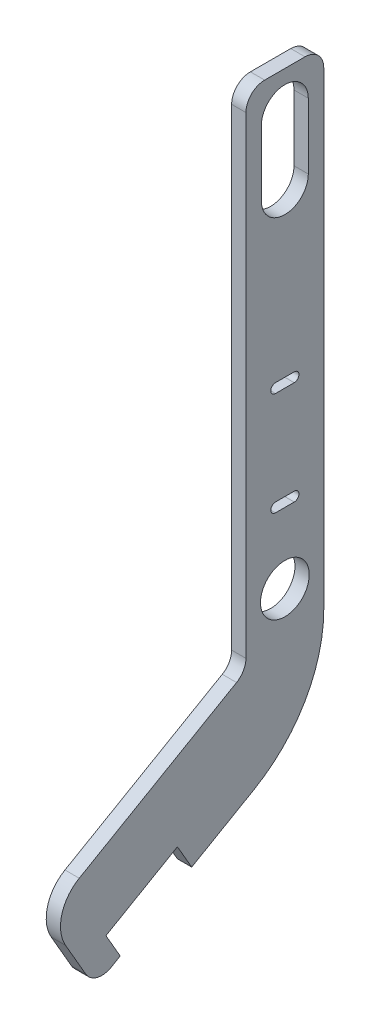
ISO-10303-21;
HEADER;
FILE_DESCRIPTION(('STEP AP214'),'2;1');
FILE_NAME('part.step','',(''),(''),'','','');
FILE_SCHEMA(('AUTOMOTIVE_DESIGN { 1 0 10303 214 1 1 1 1 }'));
ENDSEC;
DATA;
#1=APPLICATION_CONTEXT('core data for automotive mechanical design processes');
#2=APPLICATION_PROTOCOL_DEFINITION('international standard','automotive_design',2000,#1);
#3=PRODUCT_CONTEXT('',#1,'mechanical');
#4=PRODUCT('Part','Part','',(#3));
#5=PRODUCT_RELATED_PRODUCT_CATEGORY('part','',(#4));
#6=PRODUCT_DEFINITION_FORMATION('','',#4);
#7=PRODUCT_DEFINITION_CONTEXT('part definition',#1,'design');
#8=PRODUCT_DEFINITION('design','',#6,#7);
#9=PRODUCT_DEFINITION_SHAPE('','',#8);
#10=(LENGTH_UNIT() NAMED_UNIT(*) SI_UNIT(.MILLI.,.METRE.));
#11=(NAMED_UNIT(*) PLANE_ANGLE_UNIT() SI_UNIT($,.RADIAN.));
#12=(NAMED_UNIT(*) SI_UNIT($,.STERADIAN.) SOLID_ANGLE_UNIT());
#13=UNCERTAINTY_MEASURE_WITH_UNIT(LENGTH_MEASURE(1.E-05),#10,'distance_accuracy_value','');
#14=(GEOMETRIC_REPRESENTATION_CONTEXT(3) GLOBAL_UNCERTAINTY_ASSIGNED_CONTEXT((#13)) GLOBAL_UNIT_ASSIGNED_CONTEXT((#10,
#11,#12)) REPRESENTATION_CONTEXT('',''));
#15=CARTESIAN_POINT('',(0.,0.,0.));
#16=DIRECTION('',(0.,0.,1.));
#17=DIRECTION('',(1.,0.,0.));
#18=AXIS2_PLACEMENT_3D('',#15,#16,#17);
#19=CARTESIAN_POINT('',(0.,22.8,-18.4405593862111));
#20=DIRECTION('',(1.,0.,0.));
#21=DIRECTION('',(0.,0.,-1.));
#22=AXIS2_PLACEMENT_3D('',#19,#20,#21);
#23=PLANE('',#22);
#24=CARTESIAN_POINT('',(0.,45.8188404030531,-28.2201127180248));
#25=DIRECTION('',(1.,0.,0.));
#26=DIRECTION('',(0.,0.,-1.));
#27=AXIS2_PLACEMENT_3D('',#24,#25,#26);
#28=CIRCLE('',#27,0.499999999999987);
#29=CARTESIAN_POINT('',(0.,46.3188404030531,-28.2201127180248));
#30=VERTEX_POINT('',#29);
#31=CARTESIAN_POINT('',(0.,45.3188404030531,-28.2201127180248));
#32=VERTEX_POINT('',#31);
#33=EDGE_CURVE('E62',#30,#32,#28,.T.);
#34=ORIENTED_EDGE('',*,*,#33,.F.);
#35=DIRECTION('',(0.,0.,1.));
#36=VECTOR('',#35,1.);
#37=CARTESIAN_POINT('',(0.,46.3188404030531,-28.2201127180248));
#38=LINE('',#37,#36);
#39=CARTESIAN_POINT('',(0.,46.3188404030531,-30.2201127180248));
#40=VERTEX_POINT('',#39);
#41=EDGE_CURVE('E255',#40,#30,#38,.T.);
#42=ORIENTED_EDGE('',*,*,#41,.F.);
#43=CARTESIAN_POINT('',(0.,45.8188404030531,-30.2201127180248));
#44=DIRECTION('',(1.,0.,0.));
#45=DIRECTION('',(0.,0.,-1.));
#46=AXIS2_PLACEMENT_3D('',#43,#44,#45);
#47=CIRCLE('',#46,0.499999999999987);
#48=CARTESIAN_POINT('',(0.,45.3188404030532,-30.2201127180248));
#49=VERTEX_POINT('',#48);
#50=EDGE_CURVE('E239',#49,#40,#47,.T.);
#51=ORIENTED_EDGE('',*,*,#50,.F.);
#52=DIRECTION('',(0.,0.,-1.));
#53=VECTOR('',#52,1.);
#54=CARTESIAN_POINT('',(0.,45.3188404030531,-28.2201127180248));
#55=LINE('',#54,#53);
#56=EDGE_CURVE('E249',#32,#49,#55,.T.);
#57=ORIENTED_EDGE('',*,*,#56,.F.);
#58=EDGE_LOOP('',(#34,#42,#51,#57));
#59=FACE_BOUND('',#58,.T.);
#60=CARTESIAN_POINT('',(0.,34.8,-28.2201127180248));
#61=DIRECTION('',(1.,0.,0.));
#62=DIRECTION('',(0.,0.,-1.));
#63=AXIS2_PLACEMENT_3D('',#60,#61,#62);
#64=CIRCLE('',#63,0.499999999999987);
#65=CARTESIAN_POINT('',(0.,35.3,-28.2201127180248));
#66=VERTEX_POINT('',#65);
#67=CARTESIAN_POINT('',(0.,34.3,-28.2201127180248));
#68=VERTEX_POINT('',#67);
#69=EDGE_CURVE('E70',#66,#68,#64,.T.);
#70=ORIENTED_EDGE('',*,*,#69,.F.);
#71=DIRECTION('',(0.,0.,1.));
#72=VECTOR('',#71,1.);
#73=CARTESIAN_POINT('',(0.,35.3,-28.2201127180248));
#74=LINE('',#73,#72);
#75=CARTESIAN_POINT('',(0.,35.3,-30.2201127180248));
#76=VERTEX_POINT('',#75);
#77=EDGE_CURVE('E272',#76,#66,#74,.T.);
#78=ORIENTED_EDGE('',*,*,#77,.F.);
#79=CARTESIAN_POINT('',(0.,34.8,-30.2201127180248));
#80=DIRECTION('',(1.,0.,0.));
#81=DIRECTION('',(0.,0.,-1.));
#82=AXIS2_PLACEMENT_3D('',#79,#80,#81);
#83=CIRCLE('',#82,0.499999999999987);
#84=CARTESIAN_POINT('',(0.,34.3,-30.2201127180248));
#85=VERTEX_POINT('',#84);
#86=EDGE_CURVE('E269',#85,#76,#83,.T.);
#87=ORIENTED_EDGE('',*,*,#86,.F.);
#88=DIRECTION('',(0.,0.,-1.));
#89=VECTOR('',#88,1.);
#90=CARTESIAN_POINT('',(0.,34.3,-28.2201127180248));
#91=LINE('',#90,#89);
#92=EDGE_CURVE('E266',#68,#85,#91,.T.);
#93=ORIENTED_EDGE('',*,*,#92,.F.);
#94=EDGE_LOOP('',(#70,#78,#87,#93));
#95=FACE_BOUND('',#94,.T.);
#96=DIRECTION('',(0.,1.,0.));
#97=VECTOR('',#96,1.);
#98=CARTESIAN_POINT('',(0.,22.8,-33.3701127180248));
#99=LINE('',#98,#97);
#100=CARTESIAN_POINT('',(0.,22.8,-33.3701127180248));
#101=VERTEX_POINT('',#100);
#102=CARTESIAN_POINT('',(0.,72.8376808061063,-33.3701127180248));
#103=VERTEX_POINT('',#102);
#104=EDGE_CURVE('E376',#101,#103,#99,.T.);
#105=ORIENTED_EDGE('',*,*,#104,.T.);
#106=CARTESIAN_POINT('',(0.,72.8376808061063,-31.3701127180248));
#107=DIRECTION('',(1.,0.,0.));
#108=DIRECTION('',(0.,0.,-1.));
#109=AXIS2_PLACEMENT_3D('',#106,#107,#108);
#110=CIRCLE('',#109,2.);
#111=CARTESIAN_POINT('',(0.,74.8376808061063,-31.3701127180248));
#112=VERTEX_POINT('',#111);
#113=EDGE_CURVE('E383',#103,#112,#110,.T.);
#114=ORIENTED_EDGE('',*,*,#113,.T.);
#115=DIRECTION('',(0.,0.,1.));
#116=VECTOR('',#115,1.);
#117=CARTESIAN_POINT('',(0.,74.8376808061063,-33.3701127180248));
#118=LINE('',#117,#116);
#119=CARTESIAN_POINT('',(0.,74.8376808061063,-27.0701127180248));
#120=VERTEX_POINT('',#119);
#121=EDGE_CURVE('E380',#112,#120,#118,.T.);
#122=ORIENTED_EDGE('',*,*,#121,.T.);
#123=CARTESIAN_POINT('',(0.,72.8376808061063,-27.0701127180248));
#124=DIRECTION('',(1.,0.,0.));
#125=DIRECTION('',(0.,0.,-1.));
#126=AXIS2_PLACEMENT_3D('',#123,#124,#125);
#127=CIRCLE('',#126,2.);
#128=CARTESIAN_POINT('',(0.,72.8376808061063,-25.0701127180248));
#129=VERTEX_POINT('',#128);
#130=EDGE_CURVE('E377',#120,#129,#127,.T.);
#131=ORIENTED_EDGE('',*,*,#130,.T.);
#132=DIRECTION('',(0.,-1.,0.));
#133=VECTOR('',#132,1.);
#134=CARTESIAN_POINT('',(0.,64.8,-25.0701127180248));
#135=LINE('',#134,#133);
#136=CARTESIAN_POINT('',(0.,22.4365272144081,-25.0701127180249));
#137=VERTEX_POINT('',#136);
#138=EDGE_CURVE('E435',#129,#137,#135,.T.);
#139=ORIENTED_EDGE('',*,*,#138,.T.);
#140=CARTESIAN_POINT('',(0.,22.4365272144081,-23.0701127180249));
#141=DIRECTION('',(1.,0.,0.));
#142=DIRECTION('',(0.,0.,-1.));
#143=AXIS2_PLACEMENT_3D('',#140,#141,#142);
#144=CIRCLE('',#143,2.);
#145=CARTESIAN_POINT('',(0.,20.7044764068392,-24.0701127180248));
#146=VERTEX_POINT('',#145);
#147=EDGE_CURVE('E302',#137,#146,#144,.F.);
#148=ORIENTED_EDGE('',*,*,#147,.T.);
#149=DIRECTION('',(0.,-0.499999999999995,0.866025403784442));
#150=VECTOR('',#149,1.);
#151=CARTESIAN_POINT('',(0.,9.02006165897975,-3.8321127180249));
#152=LINE('',#151,#150);
#153=CARTESIAN_POINT('',(0.,11.0200616589797,-7.29621433316266));
#154=VERTEX_POINT('',#153);
#155=EDGE_CURVE('E299',#146,#154,#152,.T.);
#156=ORIENTED_EDGE('',*,*,#155,.T.);
#157=CARTESIAN_POINT('',(0.,7.55596004384196,-9.29621433316264));
#158=DIRECTION('',(1.,0.,0.));
#159=DIRECTION('',(0.,0.,-1.));
#160=AXIS2_PLACEMENT_3D('',#157,#158,#159);
#161=CIRCLE('',#160,4.);
#162=CARTESIAN_POINT('',(0.,5.55596004384197,-5.83211271802487));
#163=VERTEX_POINT('',#162);
#164=EDGE_CURVE('E297',#154,#163,#161,.T.);
#165=ORIENTED_EDGE('',*,*,#164,.T.);
#166=DIRECTION('',(0.,-0.866025403784441,-0.499999999999996));
#167=VECTOR('',#166,1.);
#168=CARTESIAN_POINT('',(0.,1.41982271536749,-8.22011271802485));
#169=LINE('',#168,#167);
#170=CARTESIAN_POINT('',(0.,1.83205080756888,-7.98211271802485));
#171=VERTEX_POINT('',#170);
#172=EDGE_CURVE('E295',#163,#171,#169,.T.);
#173=ORIENTED_EDGE('',*,*,#172,.T.);
#174=CARTESIAN_POINT('',(0.,2.83205080756887,-9.71416352559373));
#175=DIRECTION('',(1.,0.,0.));
#176=DIRECTION('',(0.,0.,-1.));
#177=AXIS2_PLACEMENT_3D('',#174,#175,#176);
#178=CIRCLE('',#177,2.);
#179=CARTESIAN_POINT('',(0.,1.09999999999999,-10.7141635255937));
#180=VERTEX_POINT('',#179);
#181=EDGE_CURVE('E293',#171,#180,#178,.T.);
#182=ORIENTED_EDGE('',*,*,#181,.T.);
#183=DIRECTION('',(0.,0.499999999999995,-0.866025403784441));
#184=VECTOR('',#183,1.);
#185=CARTESIAN_POINT('',(0.,0.0999999999999994,-8.98211271802484));
#186=LINE('',#185,#184);
#187=CARTESIAN_POINT('',(0.,1.65000000000003,-11.6667914697567));
#188=VERTEX_POINT('',#187);
#189=EDGE_CURVE('E291',#180,#188,#186,.T.);
#190=ORIENTED_EDGE('',*,*,#189,.T.);
#191=DIRECTION('',(0.,-0.866025403784439,-0.5));
#192=VECTOR('',#191,1.);
#193=CARTESIAN_POINT('',(0.,4.289645430735,-10.1427914697567));
#194=LINE('',#193,#192);
#195=CARTESIAN_POINT('',(0.,4.289645430735,-10.1427914697567));
#196=VERTEX_POINT('',#195);
#197=EDGE_CURVE('E348',#196,#188,#194,.T.);
#198=ORIENTED_EDGE('',*,*,#197,.F.);
#199=DIRECTION('',(0.,-0.5,0.866025403784439));
#200=VECTOR('',#199,1.);
#201=CARTESIAN_POINT('',(0.,6.489645430735,-13.9533032464082));
#202=LINE('',#201,#200);
#203=CARTESIAN_POINT('',(0.,8.689645430735,-17.7638150230597));
#204=VERTEX_POINT('',#203);
#205=EDGE_CURVE('E343',#204,#196,#202,.T.);
#206=ORIENTED_EDGE('',*,*,#205,.F.);
#207=DIRECTION('',(0.,0.866025403784438,0.5));
#208=VECTOR('',#207,1.);
#209=CARTESIAN_POINT('',(0.,6.05000000000003,-19.2878150230597));
#210=LINE('',#209,#208);
#211=CARTESIAN_POINT('',(0.,6.04999999999997,-19.2878150230597));
#212=VERTEX_POINT('',#211);
#213=EDGE_CURVE('E338',#212,#204,#210,.T.);
#214=ORIENTED_EDGE('',*,*,#213,.F.);
#215=CARTESIAN_POINT('',(0.,9.87062754749466,-25.9053360521179));
#216=VERTEX_POINT('',#215);
#217=EDGE_CURVE('E290',#212,#216,#186,.T.);
#218=ORIENTED_EDGE('',*,*,#217,.T.);
#219=CARTESIAN_POINT('',(0.,22.8,-18.4405593862111));
#220=DIRECTION('',(1.,0.,0.));
#221=DIRECTION('',(0.,0.,-1.));
#222=AXIS2_PLACEMENT_3D('',#219,#220,#221);
#223=CIRCLE('',#222,14.9295533318137);
#224=EDGE_CURVE('E287',#216,#101,#223,.T.);
#225=ORIENTED_EDGE('',*,*,#224,.T.);
#226=EDGE_LOOP('',(#105,#114,#122,#131,#139,#148,#156,#165,#173,#182,#190,#198,#206,#214,#218,#225));
#227=FACE_BOUND('',#226,.T.);
#228=CARTESIAN_POINT('',(0.,70.8376808061063,-29.2201127180248));
#229=DIRECTION('',(1.,0.,0.));
#230=DIRECTION('',(0.,0.,-1.));
#231=AXIS2_PLACEMENT_3D('',#228,#229,#230);
#232=CIRCLE('',#231,2.5);
#233=CARTESIAN_POINT('',(0.,70.8376808061063,-31.7201127180248));
#234=VERTEX_POINT('',#233);
#235=CARTESIAN_POINT('',(0.,70.8376808061063,-26.7201127180248));
#236=VERTEX_POINT('',#235);
#237=EDGE_CURVE('E412',#234,#236,#232,.T.);
#238=ORIENTED_EDGE('',*,*,#237,.F.);
#239=DIRECTION('',(0.,1.,0.));
#240=VECTOR('',#239,1.);
#241=CARTESIAN_POINT('',(0.,70.8376808061063,-31.7201127180248));
#242=LINE('',#241,#240);
#243=CARTESIAN_POINT('',(0.,63.8376808061063,-31.7201127180248));
#244=VERTEX_POINT('',#243);
#245=EDGE_CURVE('E407',#244,#234,#242,.T.);
#246=ORIENTED_EDGE('',*,*,#245,.F.);
#247=CARTESIAN_POINT('',(0.,63.8376808061063,-29.2201127180248));
#248=DIRECTION('',(1.,0.,0.));
#249=DIRECTION('',(0.,0.,-1.));
#250=AXIS2_PLACEMENT_3D('',#247,#248,#249);
#251=CIRCLE('',#250,2.5);
#252=CARTESIAN_POINT('',(0.,63.8376808061063,-26.7201127180248));
#253=VERTEX_POINT('',#252);
#254=EDGE_CURVE('E422',#253,#244,#251,.T.);
#255=ORIENTED_EDGE('',*,*,#254,.F.);
#256=DIRECTION('',(0.,-1.,0.));
#257=VECTOR('',#256,1.);
#258=CARTESIAN_POINT('',(0.,70.8376808061063,-26.7201127180248));
#259=LINE('',#258,#257);
#260=EDGE_CURVE('E417',#236,#253,#259,.T.);
#261=ORIENTED_EDGE('',*,*,#260,.F.);
#262=EDGE_LOOP('',(#238,#246,#255,#261));
#263=FACE_BOUND('',#262,.T.);
#264=CARTESIAN_POINT('',(0.,26.8,-29.2201127180248));
#265=DIRECTION('',(1.,0.,0.));
#266=DIRECTION('',(0.,0.,-1.));
#267=AXIS2_PLACEMENT_3D('',#264,#265,#266);
#268=CIRCLE('',#267,2.60000000000147);
#269=CARTESIAN_POINT('',(0.,26.8,-31.8201127180263));
#270=VERTEX_POINT('',#269);
#271=EDGE_CURVE('E262',#270,#270,#268,.T.);
#272=ORIENTED_EDGE('',*,*,#271,.F.);
#273=EDGE_LOOP('',(#272));
#274=FACE_BOUND('',#273,.T.);
#275=ADVANCED_FACE('F48',(#59,#95,#227,#263,#274),#23,.T.);
#276=CARTESIAN_POINT('',(-1.52399999999999,22.8,-33.3701127180248));
#277=DIRECTION('',(0.,0.,-1.));
#278=DIRECTION('',(0.,1.,0.));
#279=AXIS2_PLACEMENT_3D('',#276,#277,#278);
#280=PLANE('',#279);
#281=DIRECTION('',(0.,1.,0.));
#282=VECTOR('',#281,1.);
#283=CARTESIAN_POINT('',(-1.52399999999999,22.8,-33.3701127180248));
#284=LINE('',#283,#282);
#285=CARTESIAN_POINT('',(-1.524,22.8,-33.3701127180248));
#286=VERTEX_POINT('',#285);
#287=CARTESIAN_POINT('',(-1.524,72.8376808061062,-33.3701127180248));
#288=VERTEX_POINT('',#287);
#289=EDGE_CURVE('E432',#286,#288,#284,.T.);
#290=ORIENTED_EDGE('',*,*,#289,.T.);
#291=DIRECTION('',(1.,0.,0.));
#292=VECTOR('',#291,1.);
#293=CARTESIAN_POINT('',(-1.524,72.8376808061063,-33.3701127180248));
#294=LINE('',#293,#292);
#295=EDGE_CURVE('E373',#288,#103,#294,.T.);
#296=ORIENTED_EDGE('',*,*,#295,.T.);
#297=ORIENTED_EDGE('',*,*,#104,.F.);
#298=DIRECTION('',(1.,0.,0.));
#299=VECTOR('',#298,1.);
#300=CARTESIAN_POINT('',(-1.524,22.8,-33.3701127180248));
#301=LINE('',#300,#299);
#302=EDGE_CURVE('E324',#286,#101,#301,.T.);
#303=ORIENTED_EDGE('',*,*,#302,.F.);
#304=EDGE_LOOP('',(#290,#296,#297,#303));
#305=FACE_BOUND('',#304,.T.);
#306=ADVANCED_FACE('F475',(#305),#280,.T.);
#307=CARTESIAN_POINT('',(-1.52399999999999,64.8,-25.0701127180248));
#308=DIRECTION('',(0.,0.,1.));
#309=DIRECTION('',(0.,-1.,0.));
#310=AXIS2_PLACEMENT_3D('',#307,#308,#309);
#311=PLANE('',#310);
#312=ORIENTED_EDGE('',*,*,#138,.F.);
#313=DIRECTION('',(1.,0.,0.));
#314=VECTOR('',#313,1.);
#315=CARTESIAN_POINT('',(-1.524,72.8376808061063,-25.0701127180248));
#316=LINE('',#315,#314);
#317=CARTESIAN_POINT('',(-1.524,72.8376808061063,-25.0701127180248));
#318=VERTEX_POINT('',#317);
#319=EDGE_CURVE('E385',#129,#318,#316,.F.);
#320=ORIENTED_EDGE('',*,*,#319,.T.);
#321=DIRECTION('',(0.,-1.,0.));
#322=VECTOR('',#321,1.);
#323=CARTESIAN_POINT('',(-1.52399999999999,64.8,-25.0701127180248));
#324=LINE('',#323,#322);
#325=CARTESIAN_POINT('',(-1.524,22.4365272144081,-25.0701127180249));
#326=VERTEX_POINT('',#325);
#327=EDGE_CURVE('E434',#318,#326,#324,.T.);
#328=ORIENTED_EDGE('',*,*,#327,.T.);
#329=DIRECTION('',(1.,0.,0.));
#330=VECTOR('',#329,1.);
#331=CARTESIAN_POINT('',(0.,22.4365272144081,-25.0701127180249));
#332=LINE('',#331,#330);
#333=EDGE_CURVE('E283',#326,#137,#332,.T.);
#334=ORIENTED_EDGE('',*,*,#333,.T.);
#335=EDGE_LOOP('',(#312,#320,#328,#334));
#336=FACE_BOUND('',#335,.T.);
#337=ADVANCED_FACE('F479',(#336),#311,.T.);
#338=CARTESIAN_POINT('',(-1.52399999999999,22.8,-18.4405593862111));
#339=DIRECTION('',(1.,0.,0.));
#340=DIRECTION('',(0.,0.,-1.));
#341=AXIS2_PLACEMENT_3D('',#338,#339,#340);
#342=PLANE('',#341);
#343=DIRECTION('',(0.,0.,1.));
#344=VECTOR('',#343,1.);
#345=CARTESIAN_POINT('',(-1.52399999999999,46.3188404030531,-18.4405593862111));
#346=LINE('',#345,#344);
#347=CARTESIAN_POINT('',(-1.52399999999999,46.3188404030531,-30.2201127180248));
#348=VERTEX_POINT('',#347);
#349=CARTESIAN_POINT('',(-1.52399999999999,46.3188404030531,-28.2201127180248));
#350=VERTEX_POINT('',#349);
#351=EDGE_CURVE('E55',#348,#350,#346,.T.);
#352=ORIENTED_EDGE('',*,*,#351,.T.);
#353=CARTESIAN_POINT('',(-1.52399999999999,45.8188404030531,-28.2201127180248));
#354=DIRECTION('',(1.,0.,0.));
#355=DIRECTION('',(0.,0.,-1.));
#356=AXIS2_PLACEMENT_3D('',#353,#354,#355);
#357=CIRCLE('',#356,0.499999999999987);
#358=CARTESIAN_POINT('',(-1.52399999999999,45.3188404030531,-28.2201127180248));
#359=VERTEX_POINT('',#358);
#360=EDGE_CURVE('E12',#350,#359,#357,.T.);
#361=ORIENTED_EDGE('',*,*,#360,.T.);
#362=DIRECTION('',(0.,0.,-1.));
#363=VECTOR('',#362,1.);
#364=CARTESIAN_POINT('',(-1.52399999999999,45.3188404030531,-18.4405593862111));
#365=LINE('',#364,#363);
#366=CARTESIAN_POINT('',(-1.52399999999999,45.3188404030531,-30.2201127180248));
#367=VERTEX_POINT('',#366);
#368=EDGE_CURVE('E451',#359,#367,#365,.T.);
#369=ORIENTED_EDGE('',*,*,#368,.T.);
#370=CARTESIAN_POINT('',(-1.52399999999999,45.8188404030531,-30.2201127180248));
#371=DIRECTION('',(1.,0.,0.));
#372=DIRECTION('',(0.,0.,-1.));
#373=AXIS2_PLACEMENT_3D('',#370,#371,#372);
#374=CIRCLE('',#373,0.499999999999987);
#375=EDGE_CURVE('E242',#367,#348,#374,.T.);
#376=ORIENTED_EDGE('',*,*,#375,.T.);
#377=EDGE_LOOP('',(#352,#361,#369,#376));
#378=FACE_BOUND('',#377,.T.);
#379=DIRECTION('',(0.,0.,1.));
#380=VECTOR('',#379,1.);
#381=CARTESIAN_POINT('',(-1.52399999999999,35.3,-18.4405593862111));
#382=LINE('',#381,#380);
#383=CARTESIAN_POINT('',(-1.52399999999999,35.3,-30.2201127180248));
#384=VERTEX_POINT('',#383);
#385=CARTESIAN_POINT('',(-1.52399999999999,35.3,-28.2201127180248));
#386=VERTEX_POINT('',#385);
#387=EDGE_CURVE('E445',#384,#386,#382,.T.);
#388=ORIENTED_EDGE('',*,*,#387,.T.);
#389=CARTESIAN_POINT('',(-1.52399999999999,34.8,-28.2201127180248));
#390=DIRECTION('',(1.,0.,0.));
#391=DIRECTION('',(0.,0.,-1.));
#392=AXIS2_PLACEMENT_3D('',#389,#390,#391);
#393=CIRCLE('',#392,0.499999999999987);
#394=CARTESIAN_POINT('',(-1.52399999999999,34.3,-28.2201127180248));
#395=VERTEX_POINT('',#394);
#396=EDGE_CURVE('E448',#386,#395,#393,.T.);
#397=ORIENTED_EDGE('',*,*,#396,.T.);
#398=DIRECTION('',(0.,0.,-1.));
#399=VECTOR('',#398,1.);
#400=CARTESIAN_POINT('',(-1.52399999999999,34.3,-18.4405593862111));
#401=LINE('',#400,#399);
#402=CARTESIAN_POINT('',(-1.52399999999999,34.3,-30.2201127180248));
#403=VERTEX_POINT('',#402);
#404=EDGE_CURVE('E439',#395,#403,#401,.T.);
#405=ORIENTED_EDGE('',*,*,#404,.T.);
#406=CARTESIAN_POINT('',(-1.52399999999999,34.8,-30.2201127180248));
#407=DIRECTION('',(1.,0.,0.));
#408=DIRECTION('',(0.,0.,-1.));
#409=AXIS2_PLACEMENT_3D('',#406,#407,#408);
#410=CIRCLE('',#409,0.499999999999987);
#411=EDGE_CURVE('E442',#403,#384,#410,.T.);
#412=ORIENTED_EDGE('',*,*,#411,.T.);
#413=EDGE_LOOP('',(#388,#397,#405,#412));
#414=FACE_BOUND('',#413,.T.);
#415=ORIENTED_EDGE('',*,*,#327,.F.);
#416=CARTESIAN_POINT('',(-1.524,72.8376808061063,-27.0701127180248));
#417=DIRECTION('',(1.,0.,0.));
#418=DIRECTION('',(0.,0.,-1.));
#419=AXIS2_PLACEMENT_3D('',#416,#417,#418);
#420=CIRCLE('',#419,2.);
#421=CARTESIAN_POINT('',(-1.52399999999999,74.8376808061063,-27.0701127180248));
#422=VERTEX_POINT('',#421);
#423=EDGE_CURVE('E391',#318,#422,#420,.F.);
#424=ORIENTED_EDGE('',*,*,#423,.T.);
#425=DIRECTION('',(0.,0.,1.));
#426=VECTOR('',#425,1.);
#427=CARTESIAN_POINT('',(-1.52399999999999,74.8376808061063,-33.3701127180248));
#428=LINE('',#427,#426);
#429=CARTESIAN_POINT('',(-1.52399999999999,74.8376808061063,-31.3701127180248));
#430=VERTEX_POINT('',#429);
#431=EDGE_CURVE('E428',#430,#422,#428,.T.);
#432=ORIENTED_EDGE('',*,*,#431,.F.);
#433=CARTESIAN_POINT('',(-1.524,72.8376808061063,-31.3701127180248));
#434=DIRECTION('',(1.,0.,0.));
#435=DIRECTION('',(0.,0.,-1.));
#436=AXIS2_PLACEMENT_3D('',#433,#434,#435);
#437=CIRCLE('',#436,2.);
#438=EDGE_CURVE('E388',#430,#288,#437,.F.);
#439=ORIENTED_EDGE('',*,*,#438,.T.);
#440=ORIENTED_EDGE('',*,*,#289,.F.);
#441=CARTESIAN_POINT('',(-1.524,22.8,-18.4405593862111));
#442=DIRECTION('',(1.,0.,0.));
#443=DIRECTION('',(0.,0.,-1.));
#444=AXIS2_PLACEMENT_3D('',#441,#442,#443);
#445=CIRCLE('',#444,14.9295533318137);
#446=CARTESIAN_POINT('',(-1.524,9.87062754749466,-25.9053360521179));
#447=VERTEX_POINT('',#446);
#448=EDGE_CURVE('E327',#447,#286,#445,.T.);
#449=ORIENTED_EDGE('',*,*,#448,.F.);
#450=DIRECTION('',(0.,0.499999999999995,-0.866025403784441));
#451=VECTOR('',#450,1.);
#452=CARTESIAN_POINT('',(-1.524,0.0999999999999994,-8.98211271802484));
#453=LINE('',#452,#451);
#454=CARTESIAN_POINT('',(-1.524,6.05000000000003,-19.2878150230597));
#455=VERTEX_POINT('',#454);
#456=EDGE_CURVE('E333',#455,#447,#453,.T.);
#457=ORIENTED_EDGE('',*,*,#456,.F.);
#458=DIRECTION('',(0.,0.866025403784439,0.5));
#459=VECTOR('',#458,1.);
#460=CARTESIAN_POINT('',(-1.524,18.9793724525052,-11.8230383571529));
#461=LINE('',#460,#459);
#462=CARTESIAN_POINT('',(-1.524,8.689645430735,-17.7638150230597));
#463=VERTEX_POINT('',#462);
#464=EDGE_CURVE('E321',#455,#463,#461,.T.);
#465=ORIENTED_EDGE('',*,*,#464,.T.);
#466=DIRECTION('',(0.,-0.5,0.866025403784439));
#467=VECTOR('',#466,1.);
#468=CARTESIAN_POINT('',(-1.524,12.5102729782298,-24.3813360521179));
#469=LINE('',#468,#467);
#470=CARTESIAN_POINT('',(-1.524,4.289645430735,-10.1427914697567));
#471=VERTEX_POINT('',#470);
#472=EDGE_CURVE('E318',#463,#471,#469,.T.);
#473=ORIENTED_EDGE('',*,*,#472,.T.);
#474=DIRECTION('',(0.,-0.866025403784439,-0.5));
#475=VECTOR('',#474,1.);
#476=CARTESIAN_POINT('',(-1.524,14.5793724525052,-4.20201480384985));
#477=LINE('',#476,#475);
#478=CARTESIAN_POINT('',(-1.524,1.65000000000003,-11.6667914697567));
#479=VERTEX_POINT('',#478);
#480=EDGE_CURVE('E315',#471,#479,#477,.T.);
#481=ORIENTED_EDGE('',*,*,#480,.T.);
#482=CARTESIAN_POINT('',(-1.524,1.09999999999999,-10.7141635255937));
#483=VERTEX_POINT('',#482);
#484=EDGE_CURVE('E334',#483,#479,#453,.T.);
#485=ORIENTED_EDGE('',*,*,#484,.F.);
#486=CARTESIAN_POINT('',(-1.524,2.83205080756887,-9.71416352559373));
#487=DIRECTION('',(1.,0.,0.));
#488=DIRECTION('',(0.,0.,-1.));
#489=AXIS2_PLACEMENT_3D('',#486,#487,#488);
#490=CIRCLE('',#489,2.);
#491=CARTESIAN_POINT('',(-1.524,1.83205080756888,-7.98211271802485));
#492=VERTEX_POINT('',#491);
#493=EDGE_CURVE('E312',#483,#492,#490,.F.);
#494=ORIENTED_EDGE('',*,*,#493,.T.);
#495=DIRECTION('',(0.,-0.866025403784442,-0.499999999999995));
#496=VECTOR('',#495,1.);
#497=CARTESIAN_POINT('',(-1.524,1.41982271536749,-8.22011271802485));
#498=LINE('',#497,#496);
#499=CARTESIAN_POINT('',(-1.524,5.55596004384198,-5.83211271802488));
#500=VERTEX_POINT('',#499);
#501=EDGE_CURVE('E359',#500,#492,#498,.T.);
#502=ORIENTED_EDGE('',*,*,#501,.F.);
#503=CARTESIAN_POINT('',(-1.524,7.55596004384196,-9.29621433316264));
#504=DIRECTION('',(1.,0.,0.));
#505=DIRECTION('',(0.,0.,-1.));
#506=AXIS2_PLACEMENT_3D('',#503,#504,#505);
#507=CIRCLE('',#506,4.);
#508=CARTESIAN_POINT('',(-1.524,11.0200616589797,-7.29621433316266));
#509=VERTEX_POINT('',#508);
#510=EDGE_CURVE('E310',#500,#509,#507,.F.);
#511=ORIENTED_EDGE('',*,*,#510,.T.);
#512=DIRECTION('',(0.,-0.499999999999995,0.866025403784442));
#513=VECTOR('',#512,1.);
#514=CARTESIAN_POINT('',(-1.524,9.02006165897975,-3.8321127180249));
#515=LINE('',#514,#513);
#516=CARTESIAN_POINT('',(-1.524,20.7044764068392,-24.0701127180248));
#517=VERTEX_POINT('',#516);
#518=EDGE_CURVE('E368',#517,#509,#515,.T.);
#519=ORIENTED_EDGE('',*,*,#518,.F.);
#520=CARTESIAN_POINT('',(-1.524,22.4365272144081,-23.0701127180249));
#521=DIRECTION('',(1.,0.,0.));
#522=DIRECTION('',(0.,0.,-1.));
#523=AXIS2_PLACEMENT_3D('',#520,#521,#522);
#524=CIRCLE('',#523,2.);
#525=EDGE_CURVE('E307',#517,#326,#524,.T.);
#526=ORIENTED_EDGE('',*,*,#525,.T.);
#527=EDGE_LOOP('',(#415,#424,#432,#439,#440,#449,#457,#465,#473,#481,#485,#494,#502,#511,#519,#526));
#528=FACE_BOUND('',#527,.T.);
#529=DIRECTION('',(0.,1.,0.));
#530=VECTOR('',#529,1.);
#531=CARTESIAN_POINT('',(-1.52399999999999,70.8376808061063,-31.7201127180248));
#532=LINE('',#531,#530);
#533=CARTESIAN_POINT('',(-1.52399999999998,63.8376808061063,-31.7201127180248));
#534=VERTEX_POINT('',#533);
#535=CARTESIAN_POINT('',(-1.52399999999999,70.8376808061063,-31.7201127180248));
#536=VERTEX_POINT('',#535);
#537=EDGE_CURVE('E402',#534,#536,#532,.T.);
#538=ORIENTED_EDGE('',*,*,#537,.T.);
#539=CARTESIAN_POINT('',(-1.52399999999999,70.8376808061063,-29.2201127180248));
#540=DIRECTION('',(1.,0.,0.));
#541=DIRECTION('',(0.,0.,-1.));
#542=AXIS2_PLACEMENT_3D('',#539,#540,#541);
#543=CIRCLE('',#542,2.5);
#544=CARTESIAN_POINT('',(-1.52399999999999,70.8376808061063,-26.7201127180248));
#545=VERTEX_POINT('',#544);
#546=EDGE_CURVE('E399',#536,#545,#543,.T.);
#547=ORIENTED_EDGE('',*,*,#546,.T.);
#548=DIRECTION('',(0.,-1.,0.));
#549=VECTOR('',#548,1.);
#550=CARTESIAN_POINT('',(-1.52399999999999,70.8376808061063,-26.7201127180248));
#551=LINE('',#550,#549);
#552=CARTESIAN_POINT('',(-1.52399999999998,63.8376808061063,-26.7201127180248));
#553=VERTEX_POINT('',#552);
#554=EDGE_CURVE('E396',#545,#553,#551,.T.);
#555=ORIENTED_EDGE('',*,*,#554,.T.);
#556=CARTESIAN_POINT('',(-1.52399999999998,63.8376808061063,-29.2201127180248));
#557=DIRECTION('',(1.,0.,0.));
#558=DIRECTION('',(0.,0.,-1.));
#559=AXIS2_PLACEMENT_3D('',#556,#557,#558);
#560=CIRCLE('',#559,2.5);
#561=EDGE_CURVE('E393',#553,#534,#560,.T.);
#562=ORIENTED_EDGE('',*,*,#561,.T.);
#563=EDGE_LOOP('',(#538,#547,#555,#562));
#564=FACE_BOUND('',#563,.T.);
#565=CARTESIAN_POINT('',(-1.524,26.8,-29.2201127180248));
#566=DIRECTION('',(1.,0.,0.));
#567=DIRECTION('',(0.,0.,-1.));
#568=AXIS2_PLACEMENT_3D('',#565,#566,#567);
#569=CIRCLE('',#568,2.60000000000147);
#570=CARTESIAN_POINT('',(-1.524,26.8,-31.8201127180263));
#571=VERTEX_POINT('',#570);
#572=EDGE_CURVE('E304',#571,#571,#569,.T.);
#573=ORIENTED_EDGE('',*,*,#572,.T.);
#574=EDGE_LOOP('',(#573));
#575=FACE_BOUND('',#574,.T.);
#576=ADVANCED_FACE('F455',(#378,#414,#528,#564,#575),#342,.F.);
#577=CARTESIAN_POINT('',(-1.524,72.8376808061063,-31.3701127180248));
#578=DIRECTION('',(1.,0.,0.));
#579=DIRECTION('',(0.,0.,-1.));
#580=AXIS2_PLACEMENT_3D('',#577,#578,#579);
#581=CYLINDRICAL_SURFACE('',#580,2.);
#582=ORIENTED_EDGE('',*,*,#438,.F.);
#583=DIRECTION('',(1.,0.,0.));
#584=VECTOR('',#583,1.);
#585=CARTESIAN_POINT('',(-1.52399999999999,74.8376808061063,-31.3701127180248));
#586=LINE('',#585,#584);
#587=EDGE_CURVE('E286',#112,#430,#586,.F.);
#588=ORIENTED_EDGE('',*,*,#587,.F.);
#589=ORIENTED_EDGE('',*,*,#113,.F.);
#590=ORIENTED_EDGE('',*,*,#295,.F.);
#591=EDGE_LOOP('',(#582,#588,#589,#590));
#592=FACE_BOUND('',#591,.T.);
#593=ADVANCED_FACE('F489',(#592),#581,.T.);
#594=CARTESIAN_POINT('',(-1.52399999999999,74.8376808061063,-33.3701127180248));
#595=DIRECTION('',(0.,1.,0.));
#596=DIRECTION('',(0.,0.,1.));
#597=AXIS2_PLACEMENT_3D('',#594,#595,#596);
#598=PLANE('',#597);
#599=ORIENTED_EDGE('',*,*,#121,.F.);
#600=ORIENTED_EDGE('',*,*,#587,.T.);
#601=ORIENTED_EDGE('',*,*,#431,.T.);
#602=DIRECTION('',(1.,0.,0.));
#603=VECTOR('',#602,1.);
#604=CARTESIAN_POINT('',(-1.52399999999999,74.8376808061063,-27.0701127180248));
#605=LINE('',#604,#603);
#606=EDGE_CURVE('E425',#422,#120,#605,.T.);
#607=ORIENTED_EDGE('',*,*,#606,.T.);
#608=EDGE_LOOP('',(#599,#600,#601,#607));
#609=FACE_BOUND('',#608,.T.);
#610=ADVANCED_FACE('F510',(#609),#598,.T.);
#611=CARTESIAN_POINT('',(-1.524,72.8376808061063,-27.0701127180248));
#612=DIRECTION('',(1.,0.,0.));
#613=DIRECTION('',(0.,0.,-1.));
#614=AXIS2_PLACEMENT_3D('',#611,#612,#613);
#615=CYLINDRICAL_SURFACE('',#614,2.);
#616=ORIENTED_EDGE('',*,*,#423,.F.);
#617=ORIENTED_EDGE('',*,*,#319,.F.);
#618=ORIENTED_EDGE('',*,*,#130,.F.);
#619=ORIENTED_EDGE('',*,*,#606,.F.);
#620=EDGE_LOOP('',(#616,#617,#618,#619));
#621=FACE_BOUND('',#620,.T.);
#622=ADVANCED_FACE('F506',(#621),#615,.T.);
#623=CARTESIAN_POINT('',(-1.52399999999998,63.8376808061063,-29.2201127180248));
#624=DIRECTION('',(1.,0.,0.));
#625=DIRECTION('',(0.,0.,-1.));
#626=AXIS2_PLACEMENT_3D('',#623,#624,#625);
#627=CYLINDRICAL_SURFACE('',#626,2.5);
#628=ORIENTED_EDGE('',*,*,#254,.T.);
#629=DIRECTION('',(1.,0.,0.));
#630=VECTOR('',#629,1.);
#631=CARTESIAN_POINT('',(-1.52399999999998,63.8376808061063,-31.7201127180248));
#632=LINE('',#631,#630);
#633=EDGE_CURVE('E405',#534,#244,#632,.T.);
#634=ORIENTED_EDGE('',*,*,#633,.F.);
#635=ORIENTED_EDGE('',*,*,#561,.F.);
#636=DIRECTION('',(1.,0.,0.));
#637=VECTOR('',#636,1.);
#638=CARTESIAN_POINT('',(-1.52399999999998,63.8376808061063,-26.7201127180248));
#639=LINE('',#638,#637);
#640=EDGE_CURVE('E420',#553,#253,#639,.T.);
#641=ORIENTED_EDGE('',*,*,#640,.T.);
#642=EDGE_LOOP('',(#628,#634,#635,#641));
#643=FACE_BOUND('',#642,.T.);
#644=ADVANCED_FACE('F502',(#643),#627,.F.);
#645=CARTESIAN_POINT('',(-1.52399999999999,70.8376808061063,-26.7201127180248));
#646=DIRECTION('',(0.,0.,1.));
#647=DIRECTION('',(1.,0.,0.));
#648=AXIS2_PLACEMENT_3D('',#645,#646,#647);
#649=PLANE('',#648);
#650=ORIENTED_EDGE('',*,*,#260,.T.);
#651=ORIENTED_EDGE('',*,*,#640,.F.);
#652=ORIENTED_EDGE('',*,*,#554,.F.);
#653=DIRECTION('',(1.,0.,0.));
#654=VECTOR('',#653,1.);
#655=CARTESIAN_POINT('',(-1.52399999999999,70.8376808061063,-26.7201127180248));
#656=LINE('',#655,#654);
#657=EDGE_CURVE('E414',#545,#236,#656,.T.);
#658=ORIENTED_EDGE('',*,*,#657,.T.);
#659=EDGE_LOOP('',(#650,#651,#652,#658));
#660=FACE_BOUND('',#659,.T.);
#661=ADVANCED_FACE('F498',(#660),#649,.F.);
#662=CARTESIAN_POINT('',(-1.52399999999999,70.8376808061063,-29.2201127180248));
#663=DIRECTION('',(1.,0.,0.));
#664=DIRECTION('',(0.,0.,-1.));
#665=AXIS2_PLACEMENT_3D('',#662,#663,#664);
#666=CYLINDRICAL_SURFACE('',#665,2.5);
#667=ORIENTED_EDGE('',*,*,#237,.T.);
#668=ORIENTED_EDGE('',*,*,#657,.F.);
#669=ORIENTED_EDGE('',*,*,#546,.F.);
#670=DIRECTION('',(1.,0.,0.));
#671=VECTOR('',#670,1.);
#672=CARTESIAN_POINT('',(-1.52399999999999,70.8376808061063,-31.7201127180248));
#673=LINE('',#672,#671);
#674=EDGE_CURVE('E410',#536,#234,#673,.T.);
#675=ORIENTED_EDGE('',*,*,#674,.T.);
#676=EDGE_LOOP('',(#667,#668,#669,#675));
#677=FACE_BOUND('',#676,.T.);
#678=ADVANCED_FACE('F494',(#677),#666,.F.);
#679=CARTESIAN_POINT('',(-1.52399999999999,70.8376808061063,-31.7201127180248));
#680=DIRECTION('',(0.,0.,-1.));
#681=DIRECTION('',(-1.,0.,0.));
#682=AXIS2_PLACEMENT_3D('',#679,#680,#681);
#683=PLANE('',#682);
#684=ORIENTED_EDGE('',*,*,#245,.T.);
#685=ORIENTED_EDGE('',*,*,#674,.F.);
#686=ORIENTED_EDGE('',*,*,#537,.F.);
#687=ORIENTED_EDGE('',*,*,#633,.T.);
#688=EDGE_LOOP('',(#684,#685,#686,#687));
#689=FACE_BOUND('',#688,.T.);
#690=ADVANCED_FACE('F490',(#689),#683,.F.);
#691=CARTESIAN_POINT('',(-1.524,26.8,-29.2201127180248));
#692=DIRECTION('',(1.,0.,0.));
#693=DIRECTION('',(0.,0.,-1.));
#694=AXIS2_PLACEMENT_3D('',#691,#692,#693);
#695=CYLINDRICAL_SURFACE('',#694,2.60000000000147);
#696=CARTESIAN_POINT('',(-1.524,26.8,-31.8201127180263));
#697=CARTESIAN_POINT('',(-1.508125,26.8,-31.8201127180263));
#698=CARTESIAN_POINT('',(-1.49225,26.8,-31.8201127180263));
#699=CARTESIAN_POINT('',(-1.4605,26.8,-31.8201127180263));
#700=CARTESIAN_POINT('',(-1.444625,26.8,-31.8201127180263));
#701=CARTESIAN_POINT('',(-1.412875,26.8,-31.8201127180263));
#702=CARTESIAN_POINT('',(-1.397,26.8,-31.8201127180263));
#703=CARTESIAN_POINT('',(-1.36525,26.8,-31.8201127180263));
#704=CARTESIAN_POINT('',(-1.349375,26.8,-31.8201127180263));
#705=CARTESIAN_POINT('',(-1.317625,26.8,-31.8201127180263));
#706=CARTESIAN_POINT('',(-1.30175,26.8,-31.8201127180263));
#707=CARTESIAN_POINT('',(-1.27,26.8,-31.8201127180263));
#708=CARTESIAN_POINT('',(-1.254125,26.8,-31.8201127180263));
#709=CARTESIAN_POINT('',(-1.222375,26.8,-31.8201127180263));
#710=CARTESIAN_POINT('',(-1.2065,26.8,-31.8201127180263));
#711=CARTESIAN_POINT('',(-1.17475,26.8,-31.8201127180263));
#712=CARTESIAN_POINT('',(-1.158875,26.8,-31.8201127180263));
#713=CARTESIAN_POINT('',(-1.127125,26.8,-31.8201127180263));
#714=CARTESIAN_POINT('',(-1.11125,26.8,-31.8201127180263));
#715=CARTESIAN_POINT('',(-1.0795,26.8,-31.8201127180263));
#716=CARTESIAN_POINT('',(-1.063625,26.8,-31.8201127180263));
#717=CARTESIAN_POINT('',(-1.031875,26.8,-31.8201127180263));
#718=CARTESIAN_POINT('',(-1.016,26.8,-31.8201127180263));
#719=CARTESIAN_POINT('',(-0.98425,26.8,-31.8201127180263));
#720=CARTESIAN_POINT('',(-0.968375,26.8,-31.8201127180263));
#721=CARTESIAN_POINT('',(-0.936625,26.8,-31.8201127180263));
#722=CARTESIAN_POINT('',(-0.92075,26.8,-31.8201127180263));
#723=CARTESIAN_POINT('',(-0.889,26.8,-31.8201127180263));
#724=CARTESIAN_POINT('',(-0.873125,26.8,-31.8201127180263));
#725=CARTESIAN_POINT('',(-0.841375,26.8,-31.8201127180263));
#726=CARTESIAN_POINT('',(-0.8255,26.8,-31.8201127180263));
#727=CARTESIAN_POINT('',(-0.79375,26.8,-31.8201127180263));
#728=CARTESIAN_POINT('',(-0.777875,26.8,-31.8201127180263));
#729=CARTESIAN_POINT('',(-0.746125,26.8,-31.8201127180263));
#730=CARTESIAN_POINT('',(-0.73025,26.8,-31.8201127180263));
#731=CARTESIAN_POINT('',(-0.6985,26.8,-31.8201127180263));
#732=CARTESIAN_POINT('',(-0.682625,26.8,-31.8201127180263));
#733=CARTESIAN_POINT('',(-0.650875,26.8,-31.8201127180263));
#734=CARTESIAN_POINT('',(-0.635,26.8,-31.8201127180263));
#735=CARTESIAN_POINT('',(-0.60325,26.8,-31.8201127180263));
#736=CARTESIAN_POINT('',(-0.587375,26.8,-31.8201127180263));
#737=CARTESIAN_POINT('',(-0.555625,26.8,-31.8201127180263));
#738=CARTESIAN_POINT('',(-0.53975,26.8,-31.8201127180263));
#739=CARTESIAN_POINT('',(-0.508,26.8,-31.8201127180263));
#740=CARTESIAN_POINT('',(-0.492125,26.8,-31.8201127180263));
#741=CARTESIAN_POINT('',(-0.460375,26.8,-31.8201127180263));
#742=CARTESIAN_POINT('',(-0.4445,26.8,-31.8201127180263));
#743=CARTESIAN_POINT('',(-0.41275,26.8,-31.8201127180263));
#744=CARTESIAN_POINT('',(-0.396875,26.8,-31.8201127180263));
#745=CARTESIAN_POINT('',(-0.365125,26.8,-31.8201127180263));
#746=CARTESIAN_POINT('',(-0.34925,26.8,-31.8201127180263));
#747=CARTESIAN_POINT('',(-0.3175,26.8,-31.8201127180263));
#748=CARTESIAN_POINT('',(-0.301625,26.8,-31.8201127180263));
#749=CARTESIAN_POINT('',(-0.269875,26.8,-31.8201127180263));
#750=CARTESIAN_POINT('',(-0.254,26.8,-31.8201127180263));
#751=CARTESIAN_POINT('',(-0.22225,26.8,-31.8201127180263));
#752=CARTESIAN_POINT('',(-0.206375,26.8,-31.8201127180263));
#753=CARTESIAN_POINT('',(-0.174625,26.8,-31.8201127180263));
#754=CARTESIAN_POINT('',(-0.15875,26.8,-31.8201127180263));
#755=CARTESIAN_POINT('',(-0.127,26.8,-31.8201127180263));
#756=CARTESIAN_POINT('',(-0.111125,26.8,-31.8201127180263));
#757=CARTESIAN_POINT('',(-0.079375,26.8,-31.8201127180263));
#758=CARTESIAN_POINT('',(-0.0635,26.8,-31.8201127180263));
#759=CARTESIAN_POINT('',(-0.0317499999999999,26.8,-31.8201127180263));
#760=CARTESIAN_POINT('',(-0.015875,26.8,-31.8201127180263));
#761=CARTESIAN_POINT('',(0.,26.8,-31.8201127180263));
#762=B_SPLINE_CURVE_WITH_KNOTS('',3,(#696,#697,#698,#699,#700,#701,#702,#703,#704,#705,#706,
#707,#708,#709,#710,#711,#712,#713,#714,#715,#716,#717,#718,#719,#720,#721,#722,#723,#724,#725,
#726,#727,#728,#729,#730,#731,#732,#733,#734,#735,#736,#737,#738,#739,#740,#741,#742,#743,#744,
#745,#746,#747,#748,#749,#750,#751,#752,#753,#754,#755,#756,#757,#758,#759,#760,#761),
.UNSPECIFIED.,.F.,.F.,(4,2,2,2,2,2,2,2,2,2,2,2,2,2,2,2,2,2,2,2,2,2,2,2,2,2,2,2,2,2,2,2,4),(0.,
0.0476249999999999,0.0952499999999998,0.142875,0.1905,0.238125,0.28575,0.333375,0.381,0.428625,
0.47625,0.523875,0.5715,0.619125,0.66675,0.714375,0.762,0.809625,0.85725,0.904875,0.9525,
1.000125,1.04775,1.095375,1.143,1.190625,1.23825,1.285875,1.3335,1.381125,1.42875,1.476375,
1.524),.UNSPECIFIED.);
#763=EDGE_CURVE('BSEAM493',#571,#270,#762,.T.);
#764=ORIENTED_EDGE('',*,*,#572,.F.);
#765=ORIENTED_EDGE('',*,*,#271,.T.);
#766=ORIENTED_EDGE('',*,*,#763,.T.);
#767=ORIENTED_EDGE('',*,*,#763,.F.);
#768=EDGE_LOOP('',(#764,#766,#765,#767));
#769=FACE_BOUND('',#768,.T.);
#770=ADVANCED_FACE('F493',(#769),#695,.F.);
#771=CARTESIAN_POINT('',(-1.524,22.4365272144081,-23.0701127180249));
#772=DIRECTION('',(-1.,0.,0.));
#773=DIRECTION('',(0.,0.,1.));
#774=AXIS2_PLACEMENT_3D('',#771,#772,#773);
#775=CYLINDRICAL_SURFACE('',#774,2.);
#776=ORIENTED_EDGE('',*,*,#525,.F.);
#777=DIRECTION('',(1.,0.,0.));
#778=VECTOR('',#777,1.);
#779=CARTESIAN_POINT('',(-1.524,20.7044764068392,-24.0701127180248));
#780=LINE('',#779,#778);
#781=EDGE_CURVE('E363',#146,#517,#780,.F.);
#782=ORIENTED_EDGE('',*,*,#781,.F.);
#783=ORIENTED_EDGE('',*,*,#147,.F.);
#784=ORIENTED_EDGE('',*,*,#333,.F.);
#785=EDGE_LOOP('',(#776,#782,#783,#784));
#786=FACE_BOUND('',#785,.T.);
#787=ADVANCED_FACE('F555',(#786),#775,.F.);
#788=CARTESIAN_POINT('',(-1.524,9.02006165897975,-3.8321127180249));
#789=DIRECTION('',(0.,0.866025403784442,0.499999999999995));
#790=DIRECTION('',(0.,-0.499999999999995,0.866025403784442));
#791=AXIS2_PLACEMENT_3D('',#788,#789,#790);
#792=PLANE('',#791);
#793=ORIENTED_EDGE('',*,*,#518,.T.);
#794=DIRECTION('',(1.,0.,0.));
#795=VECTOR('',#794,1.);
#796=CARTESIAN_POINT('',(-1.524,11.0200616589797,-7.29621433316266));
#797=LINE('',#796,#795);
#798=EDGE_CURVE('E365',#509,#154,#797,.T.);
#799=ORIENTED_EDGE('',*,*,#798,.T.);
#800=ORIENTED_EDGE('',*,*,#155,.F.);
#801=ORIENTED_EDGE('',*,*,#781,.T.);
#802=EDGE_LOOP('',(#793,#799,#800,#801));
#803=FACE_BOUND('',#802,.T.);
#804=ADVANCED_FACE('F551',(#803),#792,.T.);
#805=CARTESIAN_POINT('',(-1.524,7.55596004384196,-9.29621433316264));
#806=DIRECTION('',(1.,0.,0.));
#807=DIRECTION('',(0.,0.,-1.));
#808=AXIS2_PLACEMENT_3D('',#805,#806,#807);
#809=CYLINDRICAL_SURFACE('',#808,4.);
#810=ORIENTED_EDGE('',*,*,#510,.F.);
#811=DIRECTION('',(1.,0.,0.));
#812=VECTOR('',#811,1.);
#813=CARTESIAN_POINT('',(-1.524,5.55596004384197,-5.83211271802487));
#814=LINE('',#813,#812);
#815=EDGE_CURVE('E361',#163,#500,#814,.F.);
#816=ORIENTED_EDGE('',*,*,#815,.F.);
#817=ORIENTED_EDGE('',*,*,#164,.F.);
#818=ORIENTED_EDGE('',*,*,#798,.F.);
#819=EDGE_LOOP('',(#810,#816,#817,#818));
#820=FACE_BOUND('',#819,.T.);
#821=ADVANCED_FACE('F547',(#820),#809,.T.);
#822=CARTESIAN_POINT('',(-1.524,1.41982271536749,-8.22011271802485));
#823=DIRECTION('',(0.,-0.499999999999996,0.866025403784441));
#824=DIRECTION('',(0.,-0.866025403784441,-0.499999999999996));
#825=AXIS2_PLACEMENT_3D('',#822,#823,#824);
#826=PLANE('',#825);
#827=ORIENTED_EDGE('',*,*,#172,.F.);
#828=ORIENTED_EDGE('',*,*,#815,.T.);
#829=ORIENTED_EDGE('',*,*,#501,.T.);
#830=DIRECTION('',(1.,0.,0.));
#831=VECTOR('',#830,1.);
#832=CARTESIAN_POINT('',(-1.524,1.83205080756888,-7.98211271802485));
#833=LINE('',#832,#831);
#834=EDGE_CURVE('E356',#492,#171,#833,.T.);
#835=ORIENTED_EDGE('',*,*,#834,.T.);
#836=EDGE_LOOP('',(#827,#828,#829,#835));
#837=FACE_BOUND('',#836,.T.);
#838=ADVANCED_FACE('F543',(#837),#826,.T.);
#839=CARTESIAN_POINT('',(-1.524,2.83205080756887,-9.71416352559373));
#840=DIRECTION('',(1.,0.,0.));
#841=DIRECTION('',(0.,0.,-1.));
#842=AXIS2_PLACEMENT_3D('',#839,#840,#841);
#843=CYLINDRICAL_SURFACE('',#842,2.);
#844=ORIENTED_EDGE('',*,*,#493,.F.);
#845=DIRECTION('',(1.,0.,0.));
#846=VECTOR('',#845,1.);
#847=CARTESIAN_POINT('',(-1.524,1.09999999999999,-10.7141635255937));
#848=LINE('',#847,#846);
#849=EDGE_CURVE('E337',#180,#483,#848,.F.);
#850=ORIENTED_EDGE('',*,*,#849,.F.);
#851=ORIENTED_EDGE('',*,*,#181,.F.);
#852=ORIENTED_EDGE('',*,*,#834,.F.);
#853=EDGE_LOOP('',(#844,#850,#851,#852));
#854=FACE_BOUND('',#853,.T.);
#855=ADVANCED_FACE('F540',(#854),#843,.T.);
#856=CARTESIAN_POINT('',(-1.524,0.0999999999999994,-8.98211271802484));
#857=DIRECTION('',(0.,-0.866025403784441,-0.499999999999995));
#858=DIRECTION('',(0.,0.499999999999995,-0.866025403784441));
#859=AXIS2_PLACEMENT_3D('',#856,#857,#858);
#860=PLANE('',#859);
#861=ORIENTED_EDGE('',*,*,#189,.F.);
#862=ORIENTED_EDGE('',*,*,#849,.T.);
#863=ORIENTED_EDGE('',*,*,#484,.T.);
#864=DIRECTION('',(1.,0.,0.));
#865=VECTOR('',#864,1.);
#866=CARTESIAN_POINT('',(-10.,1.65000000000003,-11.6667914697567));
#867=LINE('',#866,#865);
#868=EDGE_CURVE('E336',#479,#188,#867,.T.);
#869=ORIENTED_EDGE('',*,*,#868,.T.);
#870=EDGE_LOOP('',(#861,#862,#863,#869));
#871=FACE_BOUND('',#870,.T.);
#872=ADVANCED_FACE('F535',(#871),#860,.T.);
#873=CARTESIAN_POINT('',(-10.,4.289645430735,-10.1427914697567));
#874=DIRECTION('',(0.,-0.5,0.866025403784439));
#875=DIRECTION('',(0.,-0.866025403784439,-0.5));
#876=AXIS2_PLACEMENT_3D('',#873,#874,#875);
#877=PLANE('',#876);
#878=DIRECTION('',(1.,0.,0.));
#879=VECTOR('',#878,1.);
#880=CARTESIAN_POINT('',(-10.,4.289645430735,-10.1427914697567));
#881=LINE('',#880,#879);
#882=EDGE_CURVE('E351',#471,#196,#881,.T.);
#883=ORIENTED_EDGE('',*,*,#882,.T.);
#884=ORIENTED_EDGE('',*,*,#197,.T.);
#885=ORIENTED_EDGE('',*,*,#868,.F.);
#886=ORIENTED_EDGE('',*,*,#480,.F.);
#887=EDGE_LOOP('',(#883,#884,#885,#886));
#888=FACE_BOUND('',#887,.T.);
#889=ADVANCED_FACE('F531',(#888),#877,.F.);
#890=CARTESIAN_POINT('',(-10.,6.489645430735,-13.9533032464082));
#891=DIRECTION('',(0.,0.866025403784438,0.5));
#892=DIRECTION('',(0.,-0.5,0.866025403784439));
#893=AXIS2_PLACEMENT_3D('',#890,#891,#892);
#894=PLANE('',#893);
#895=DIRECTION('',(1.,0.,0.));
#896=VECTOR('',#895,1.);
#897=CARTESIAN_POINT('',(-10.,8.689645430735,-17.7638150230597));
#898=LINE('',#897,#896);
#899=EDGE_CURVE('E346',#463,#204,#898,.T.);
#900=ORIENTED_EDGE('',*,*,#899,.T.);
#901=ORIENTED_EDGE('',*,*,#205,.T.);
#902=ORIENTED_EDGE('',*,*,#882,.F.);
#903=ORIENTED_EDGE('',*,*,#472,.F.);
#904=EDGE_LOOP('',(#900,#901,#902,#903));
#905=FACE_BOUND('',#904,.T.);
#906=ADVANCED_FACE('F527',(#905),#894,.F.);
#907=CARTESIAN_POINT('',(-10.,6.05000000000003,-19.2878150230597));
#908=DIRECTION('',(0.,0.5,-0.866025403784439));
#909=DIRECTION('',(0.,0.866025403784439,0.5));
#910=AXIS2_PLACEMENT_3D('',#907,#908,#909);
#911=PLANE('',#910);
#912=DIRECTION('',(1.,0.,0.));
#913=VECTOR('',#912,1.);
#914=CARTESIAN_POINT('',(-10.,6.05000000000003,-19.2878150230597));
#915=LINE('',#914,#913);
#916=EDGE_CURVE('E341',#455,#212,#915,.T.);
#917=ORIENTED_EDGE('',*,*,#916,.T.);
#918=ORIENTED_EDGE('',*,*,#213,.T.);
#919=ORIENTED_EDGE('',*,*,#899,.F.);
#920=ORIENTED_EDGE('',*,*,#464,.F.);
#921=EDGE_LOOP('',(#917,#918,#919,#920));
#922=FACE_BOUND('',#921,.T.);
#923=ADVANCED_FACE('F524',(#922),#911,.F.);
#924=ORIENTED_EDGE('',*,*,#916,.F.);
#925=ORIENTED_EDGE('',*,*,#456,.T.);
#926=DIRECTION('',(1.,0.,0.));
#927=VECTOR('',#926,1.);
#928=CARTESIAN_POINT('',(-1.524,9.87062754749466,-25.9053360521179));
#929=LINE('',#928,#927);
#930=EDGE_CURVE('E330',#447,#216,#929,.T.);
#931=ORIENTED_EDGE('',*,*,#930,.T.);
#932=ORIENTED_EDGE('',*,*,#217,.F.);
#933=EDGE_LOOP('',(#924,#925,#931,#932));
#934=FACE_BOUND('',#933,.T.);
#935=ADVANCED_FACE('F522',(#934),#860,.T.);
#936=CARTESIAN_POINT('',(-1.524,22.8,-18.4405593862111));
#937=DIRECTION('',(1.,0.,0.));
#938=DIRECTION('',(0.,0.,-1.));
#939=AXIS2_PLACEMENT_3D('',#936,#937,#938);
#940=CYLINDRICAL_SURFACE('',#939,14.9295533318137);
#941=ORIENTED_EDGE('',*,*,#224,.F.);
#942=ORIENTED_EDGE('',*,*,#930,.F.);
#943=ORIENTED_EDGE('',*,*,#448,.T.);
#944=ORIENTED_EDGE('',*,*,#302,.T.);
#945=EDGE_LOOP('',(#941,#942,#943,#944));
#946=FACE_BOUND('',#945,.T.);
#947=ADVANCED_FACE('F518',(#946),#940,.T.);
#948=CARTESIAN_POINT('',(-10.,34.8,-28.2201127180248));
#949=DIRECTION('',(1.,0.,0.));
#950=DIRECTION('',(0.,0.,-1.));
#951=AXIS2_PLACEMENT_3D('',#948,#949,#950);
#952=CYLINDRICAL_SURFACE('',#951,0.499999999999987);
#953=DIRECTION('',(1.,0.,0.));
#954=VECTOR('',#953,1.);
#955=CARTESIAN_POINT('',(-10.,35.3,-28.2201127180248));
#956=LINE('',#955,#954);
#957=EDGE_CURVE('E276',#386,#66,#956,.T.);
#958=ORIENTED_EDGE('',*,*,#957,.T.);
#959=ORIENTED_EDGE('',*,*,#69,.T.);
#960=DIRECTION('',(1.,0.,0.));
#961=VECTOR('',#960,1.);
#962=CARTESIAN_POINT('',(-10.,34.3,-28.2201127180248));
#963=LINE('',#962,#961);
#964=EDGE_CURVE('E275',#395,#68,#963,.T.);
#965=ORIENTED_EDGE('',*,*,#964,.F.);
#966=ORIENTED_EDGE('',*,*,#396,.F.);
#967=EDGE_LOOP('',(#958,#959,#965,#966));
#968=FACE_BOUND('',#967,.T.);
#969=ADVANCED_FACE('F521',(#968),#952,.F.);
#970=CARTESIAN_POINT('',(-10.,35.3,-28.2201127180248));
#971=DIRECTION('',(0.,1.,0.));
#972=DIRECTION('',(0.,0.,1.));
#973=AXIS2_PLACEMENT_3D('',#970,#971,#972);
#974=PLANE('',#973);
#975=DIRECTION('',(1.,0.,0.));
#976=VECTOR('',#975,1.);
#977=CARTESIAN_POINT('',(-10.,35.3,-30.2201127180248));
#978=LINE('',#977,#976);
#979=EDGE_CURVE('E278',#384,#76,#978,.T.);
#980=ORIENTED_EDGE('',*,*,#979,.T.);
#981=ORIENTED_EDGE('',*,*,#77,.T.);
#982=ORIENTED_EDGE('',*,*,#957,.F.);
#983=ORIENTED_EDGE('',*,*,#387,.F.);
#984=EDGE_LOOP('',(#980,#981,#982,#983));
#985=FACE_BOUND('',#984,.T.);
#986=ADVANCED_FACE('F564',(#985),#974,.F.);
#987=CARTESIAN_POINT('',(-10.,34.8,-30.2201127180248));
#988=DIRECTION('',(1.,0.,0.));
#989=DIRECTION('',(0.,0.,-1.));
#990=AXIS2_PLACEMENT_3D('',#987,#988,#989);
#991=CYLINDRICAL_SURFACE('',#990,0.499999999999987);
#992=DIRECTION('',(1.,0.,0.));
#993=VECTOR('',#992,1.);
#994=CARTESIAN_POINT('',(-10.,34.3,-30.2201127180248));
#995=LINE('',#994,#993);
#996=EDGE_CURVE('E280',#403,#85,#995,.T.);
#997=ORIENTED_EDGE('',*,*,#996,.T.);
#998=ORIENTED_EDGE('',*,*,#86,.T.);
#999=ORIENTED_EDGE('',*,*,#979,.F.);
#1000=ORIENTED_EDGE('',*,*,#411,.F.);
#1001=EDGE_LOOP('',(#997,#998,#999,#1000));
#1002=FACE_BOUND('',#1001,.T.);
#1003=ADVANCED_FACE('F469',(#1002),#991,.F.);
#1004=CARTESIAN_POINT('',(-10.,34.3,-28.2201127180248));
#1005=DIRECTION('',(0.,-1.,0.));
#1006=DIRECTION('',(0.,0.,-1.));
#1007=AXIS2_PLACEMENT_3D('',#1004,#1005,#1006);
#1008=PLANE('',#1007);
#1009=ORIENTED_EDGE('',*,*,#964,.T.);
#1010=ORIENTED_EDGE('',*,*,#92,.T.);
#1011=ORIENTED_EDGE('',*,*,#996,.F.);
#1012=ORIENTED_EDGE('',*,*,#404,.F.);
#1013=EDGE_LOOP('',(#1009,#1010,#1011,#1012));
#1014=FACE_BOUND('',#1013,.T.);
#1015=ADVANCED_FACE('F462',(#1014),#1008,.F.);
#1016=CARTESIAN_POINT('',(-10.,45.8188404030531,-28.2201127180248));
#1017=DIRECTION('',(1.,0.,0.));
#1018=DIRECTION('',(0.,0.,-1.));
#1019=AXIS2_PLACEMENT_3D('',#1016,#1017,#1018);
#1020=CYLINDRICAL_SURFACE('',#1019,0.499999999999987);
#1021=DIRECTION('',(1.,0.,0.));
#1022=VECTOR('',#1021,1.);
#1023=CARTESIAN_POINT('',(-10.,46.3188404030531,-28.2201127180248));
#1024=LINE('',#1023,#1022);
#1025=EDGE_CURVE('E260',#350,#30,#1024,.T.);
#1026=ORIENTED_EDGE('',*,*,#1025,.T.);
#1027=ORIENTED_EDGE('',*,*,#33,.T.);
#1028=DIRECTION('',(1.,0.,0.));
#1029=VECTOR('',#1028,1.);
#1030=CARTESIAN_POINT('',(-10.,45.3188404030531,-28.2201127180248));
#1031=LINE('',#1030,#1029);
#1032=EDGE_CURVE('E246',#359,#32,#1031,.T.);
#1033=ORIENTED_EDGE('',*,*,#1032,.F.);
#1034=ORIENTED_EDGE('',*,*,#360,.F.);
#1035=EDGE_LOOP('',(#1026,#1027,#1033,#1034));
#1036=FACE_BOUND('',#1035,.T.);
#1037=ADVANCED_FACE('F460',(#1036),#1020,.F.);
#1038=CARTESIAN_POINT('',(-10.,46.3188404030531,-28.2201127180248));
#1039=DIRECTION('',(0.,1.,0.));
#1040=DIRECTION('',(0.,0.,1.));
#1041=AXIS2_PLACEMENT_3D('',#1038,#1039,#1040);
#1042=PLANE('',#1041);
#1043=DIRECTION('',(1.,0.,0.));
#1044=VECTOR('',#1043,1.);
#1045=CARTESIAN_POINT('',(-10.,46.3188404030531,-30.2201127180248));
#1046=LINE('',#1045,#1044);
#1047=EDGE_CURVE('E245',#348,#40,#1046,.T.);
#1048=ORIENTED_EDGE('',*,*,#1047,.T.);
#1049=ORIENTED_EDGE('',*,*,#41,.T.);
#1050=ORIENTED_EDGE('',*,*,#1025,.F.);
#1051=ORIENTED_EDGE('',*,*,#351,.F.);
#1052=EDGE_LOOP('',(#1048,#1049,#1050,#1051));
#1053=FACE_BOUND('',#1052,.T.);
#1054=ADVANCED_FACE('F459',(#1053),#1042,.F.);
#1055=CARTESIAN_POINT('',(-10.,45.8188404030531,-30.2201127180248));
#1056=DIRECTION('',(1.,0.,0.));
#1057=DIRECTION('',(0.,0.,-1.));
#1058=AXIS2_PLACEMENT_3D('',#1055,#1056,#1057);
#1059=CYLINDRICAL_SURFACE('',#1058,0.499999999999987);
#1060=DIRECTION('',(1.,0.,0.));
#1061=VECTOR('',#1060,1.);
#1062=CARTESIAN_POINT('',(-10.,45.3188404030532,-30.2201127180248));
#1063=LINE('',#1062,#1061);
#1064=EDGE_CURVE('E234',#367,#49,#1063,.T.);
#1065=ORIENTED_EDGE('',*,*,#1064,.T.);
#1066=ORIENTED_EDGE('',*,*,#50,.T.);
#1067=ORIENTED_EDGE('',*,*,#1047,.F.);
#1068=ORIENTED_EDGE('',*,*,#375,.F.);
#1069=EDGE_LOOP('',(#1065,#1066,#1067,#1068));
#1070=FACE_BOUND('',#1069,.T.);
#1071=ADVANCED_FACE('F236',(#1070),#1059,.F.);
#1072=CARTESIAN_POINT('',(-10.,45.3188404030531,-28.2201127180248));
#1073=DIRECTION('',(0.,-1.,0.));
#1074=DIRECTION('',(0.,0.,-1.));
#1075=AXIS2_PLACEMENT_3D('',#1072,#1073,#1074);
#1076=PLANE('',#1075);
#1077=ORIENTED_EDGE('',*,*,#1032,.T.);
#1078=ORIENTED_EDGE('',*,*,#56,.T.);
#1079=ORIENTED_EDGE('',*,*,#1064,.F.);
#1080=ORIENTED_EDGE('',*,*,#368,.F.);
#1081=EDGE_LOOP('',(#1077,#1078,#1079,#1080));
#1082=FACE_BOUND('',#1081,.T.);
#1083=ADVANCED_FACE('F250',(#1082),#1076,.F.);
#1084=CLOSED_SHELL('',(#275,#306,#337,#576,#593,#610,#622,#644,#661,#678,#690,#770,#787,#804,
#821,#838,#855,#872,#889,#906,#923,#935,#947,#969,#986,#1003,#1015,#1037,#1054,#1071,#1083));
#1085=MANIFOLD_SOLID_BREP('B2',#1084);
#1086=ADVANCED_BREP_SHAPE_REPRESENTATION('',(#18,#1085),#14);
#1087=SHAPE_DEFINITION_REPRESENTATION(#9,#1086);
ENDSEC;
END-ISO-10303-21;
